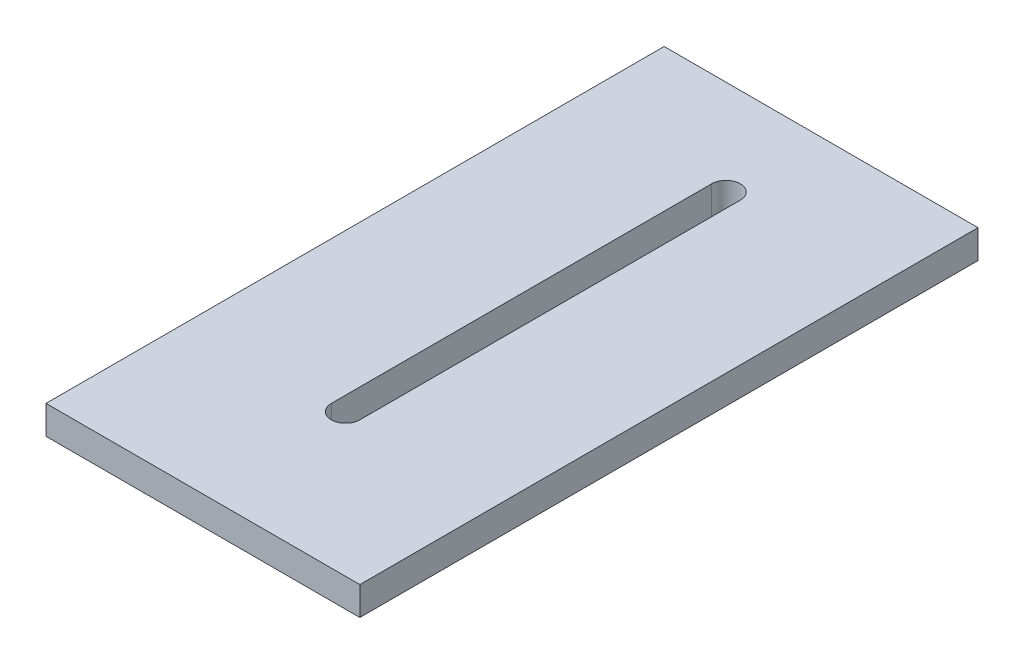
ISO-10303-21;
HEADER;
FILE_DESCRIPTION(('STEP AP214'),'2;1');
FILE_NAME('part.step','',(''),(''),'','','');
FILE_SCHEMA(('AUTOMOTIVE_DESIGN { 1 0 10303 214 1 1 1 1 }'));
ENDSEC;
DATA;
#1=APPLICATION_CONTEXT('core data for automotive mechanical design processes');
#2=APPLICATION_PROTOCOL_DEFINITION('international standard','automotive_design',2000,#1);
#3=PRODUCT_CONTEXT('',#1,'mechanical');
#4=PRODUCT('Part','Part','',(#3));
#5=PRODUCT_RELATED_PRODUCT_CATEGORY('part','',(#4));
#6=PRODUCT_DEFINITION_FORMATION('','',#4);
#7=PRODUCT_DEFINITION_CONTEXT('part definition',#1,'design');
#8=PRODUCT_DEFINITION('design','',#6,#7);
#9=PRODUCT_DEFINITION_SHAPE('','',#8);
#10=(LENGTH_UNIT() NAMED_UNIT(*) SI_UNIT(.MILLI.,.METRE.));
#11=(NAMED_UNIT(*) PLANE_ANGLE_UNIT() SI_UNIT($,.RADIAN.));
#12=(NAMED_UNIT(*) SI_UNIT($,.STERADIAN.) SOLID_ANGLE_UNIT());
#13=UNCERTAINTY_MEASURE_WITH_UNIT(LENGTH_MEASURE(1.E-05),#10,'distance_accuracy_value','');
#14=(GEOMETRIC_REPRESENTATION_CONTEXT(3) GLOBAL_UNCERTAINTY_ASSIGNED_CONTEXT((#13)) GLOBAL_UNIT_ASSIGNED_CONTEXT((#10,
#11,#12)) REPRESENTATION_CONTEXT('',''));
#15=CARTESIAN_POINT('',(0.,0.,0.));
#16=DIRECTION('',(0.,0.,1.));
#17=DIRECTION('',(1.,0.,0.));
#18=AXIS2_PLACEMENT_3D('',#15,#16,#17);
#19=CARTESIAN_POINT('',(0.,3.,0.));
#20=DIRECTION('',(0.,-1.,0.));
#21=DIRECTION('',(0.,0.,-1.));
#22=AXIS2_PLACEMENT_3D('',#19,#20,#21);
#23=PLANE('',#22);
#24=DIRECTION('',(0.,0.,1.));
#25=VECTOR('',#24,1.);
#26=CARTESIAN_POINT('',(0.,3.,0.));
#27=LINE('',#26,#25);
#28=CARTESIAN_POINT('',(0.,3.,-65.));
#29=VERTEX_POINT('',#28);
#30=CARTESIAN_POINT('',(0.,3.,0.));
#31=VERTEX_POINT('',#30);
#32=EDGE_CURVE('E136',#29,#31,#27,.T.);
#33=ORIENTED_EDGE('',*,*,#32,.T.);
#34=DIRECTION('',(1.,0.,0.));
#35=VECTOR('',#34,1.);
#36=CARTESIAN_POINT('',(0.,3.,0.));
#37=LINE('',#36,#35);
#38=CARTESIAN_POINT('',(33.,3.,0.));
#39=VERTEX_POINT('',#38);
#40=EDGE_CURVE('E139',#31,#39,#37,.T.);
#41=ORIENTED_EDGE('',*,*,#40,.T.);
#42=DIRECTION('',(0.,0.,-1.));
#43=VECTOR('',#42,1.);
#44=CARTESIAN_POINT('',(33.,3.,0.));
#45=LINE('',#44,#43);
#46=CARTESIAN_POINT('',(33.,3.,-65.));
#47=VERTEX_POINT('',#46);
#48=EDGE_CURVE('E142',#39,#47,#45,.T.);
#49=ORIENTED_EDGE('',*,*,#48,.T.);
#50=DIRECTION('',(-1.,0.,0.));
#51=VECTOR('',#50,1.);
#52=CARTESIAN_POINT('',(0.,3.,-65.));
#53=LINE('',#52,#51);
#54=EDGE_CURVE('E144',#47,#29,#53,.T.);
#55=ORIENTED_EDGE('',*,*,#54,.T.);
#56=EDGE_LOOP('',(#33,#41,#49,#55));
#57=FACE_BOUND('',#56,.T.);
#58=CARTESIAN_POINT('',(16.5,3.,-15.));
#59=DIRECTION('',(0.,1.,0.));
#60=DIRECTION('',(0.,0.,1.));
#61=AXIS2_PLACEMENT_3D('',#58,#59,#60);
#62=CIRCLE('',#61,1.5);
#63=CARTESIAN_POINT('',(15.,3.,-15.));
#64=VERTEX_POINT('',#63);
#65=CARTESIAN_POINT('',(18.,3.,-15.));
#66=VERTEX_POINT('',#65);
#67=EDGE_CURVE('E100',#64,#66,#62,.T.);
#68=ORIENTED_EDGE('',*,*,#67,.F.);
#69=DIRECTION('',(0.,0.,1.));
#70=VECTOR('',#69,1.);
#71=CARTESIAN_POINT('',(15.,3.,-15.));
#72=LINE('',#71,#70);
#73=CARTESIAN_POINT('',(15.,3.,-55.));
#74=VERTEX_POINT('',#73);
#75=EDGE_CURVE('E122',#74,#64,#72,.T.);
#76=ORIENTED_EDGE('',*,*,#75,.F.);
#77=CARTESIAN_POINT('',(16.5,3.,-55.));
#78=DIRECTION('',(0.,1.,0.));
#79=DIRECTION('',(0.,0.,1.));
#80=AXIS2_PLACEMENT_3D('',#77,#78,#79);
#81=CIRCLE('',#80,1.5);
#82=CARTESIAN_POINT('',(18.,3.,-55.));
#83=VERTEX_POINT('',#82);
#84=EDGE_CURVE('E120',#83,#74,#81,.T.);
#85=ORIENTED_EDGE('',*,*,#84,.F.);
#86=DIRECTION('',(0.,0.,-1.));
#87=VECTOR('',#86,1.);
#88=CARTESIAN_POINT('',(18.,3.,-55.));
#89=LINE('',#88,#87);
#90=EDGE_CURVE('E108',#66,#83,#89,.T.);
#91=ORIENTED_EDGE('',*,*,#90,.F.);
#92=EDGE_LOOP('',(#68,#76,#85,#91));
#93=FACE_BOUND('',#92,.T.);
#94=ADVANCED_FACE('F35',(#57,#93),#23,.F.);
#95=CARTESIAN_POINT('',(0.,0.,0.));
#96=DIRECTION('',(0.,-1.,0.));
#97=DIRECTION('',(0.,0.,-1.));
#98=AXIS2_PLACEMENT_3D('',#95,#96,#97);
#99=PLANE('',#98);
#100=DIRECTION('',(0.,0.,1.));
#101=VECTOR('',#100,1.);
#102=CARTESIAN_POINT('',(0.,0.,0.));
#103=LINE('',#102,#101);
#104=CARTESIAN_POINT('',(0.,0.,-65.));
#105=VERTEX_POINT('',#104);
#106=CARTESIAN_POINT('',(0.,0.,0.));
#107=VERTEX_POINT('',#106);
#108=EDGE_CURVE('E116',#105,#107,#103,.T.);
#109=ORIENTED_EDGE('',*,*,#108,.F.);
#110=DIRECTION('',(-1.,0.,0.));
#111=VECTOR('',#110,1.);
#112=CARTESIAN_POINT('',(0.,0.,-65.));
#113=LINE('',#112,#111);
#114=CARTESIAN_POINT('',(33.,0.,-65.));
#115=VERTEX_POINT('',#114);
#116=EDGE_CURVE('E140',#115,#105,#113,.T.);
#117=ORIENTED_EDGE('',*,*,#116,.F.);
#118=DIRECTION('',(0.,0.,-1.));
#119=VECTOR('',#118,1.);
#120=CARTESIAN_POINT('',(33.,0.,0.));
#121=LINE('',#120,#119);
#122=CARTESIAN_POINT('',(33.,0.,0.));
#123=VERTEX_POINT('',#122);
#124=EDGE_CURVE('E151',#123,#115,#121,.T.);
#125=ORIENTED_EDGE('',*,*,#124,.F.);
#126=DIRECTION('',(1.,0.,0.));
#127=VECTOR('',#126,1.);
#128=CARTESIAN_POINT('',(0.,0.,0.));
#129=LINE('',#128,#127);
#130=EDGE_CURVE('E149',#107,#123,#129,.T.);
#131=ORIENTED_EDGE('',*,*,#130,.F.);
#132=EDGE_LOOP('',(#109,#117,#125,#131));
#133=FACE_BOUND('',#132,.T.);
#134=DIRECTION('',(0.,0.,1.));
#135=VECTOR('',#134,1.);
#136=CARTESIAN_POINT('',(15.,0.,-15.));
#137=LINE('',#136,#135);
#138=CARTESIAN_POINT('',(15.,0.,-55.));
#139=VERTEX_POINT('',#138);
#140=CARTESIAN_POINT('',(15.,0.,-15.));
#141=VERTEX_POINT('',#140);
#142=EDGE_CURVE('E109',#139,#141,#137,.T.);
#143=ORIENTED_EDGE('',*,*,#142,.T.);
#144=CARTESIAN_POINT('',(16.5,0.,-15.));
#145=DIRECTION('',(0.,1.,0.));
#146=DIRECTION('',(0.,0.,1.));
#147=AXIS2_PLACEMENT_3D('',#144,#145,#146);
#148=CIRCLE('',#147,1.5);
#149=CARTESIAN_POINT('',(18.,0.,-15.));
#150=VERTEX_POINT('',#149);
#151=EDGE_CURVE('E58',#141,#150,#148,.T.);
#152=ORIENTED_EDGE('',*,*,#151,.T.);
#153=DIRECTION('',(0.,0.,-1.));
#154=VECTOR('',#153,1.);
#155=CARTESIAN_POINT('',(18.,0.,-55.));
#156=LINE('',#155,#154);
#157=CARTESIAN_POINT('',(18.,0.,-55.));
#158=VERTEX_POINT('',#157);
#159=EDGE_CURVE('E115',#150,#158,#156,.T.);
#160=ORIENTED_EDGE('',*,*,#159,.T.);
#161=CARTESIAN_POINT('',(16.5,0.,-55.));
#162=DIRECTION('',(0.,1.,0.));
#163=DIRECTION('',(0.,0.,1.));
#164=AXIS2_PLACEMENT_3D('',#161,#162,#163);
#165=CIRCLE('',#164,1.5);
#166=EDGE_CURVE('E128',#158,#139,#165,.T.);
#167=ORIENTED_EDGE('',*,*,#166,.T.);
#168=EDGE_LOOP('',(#143,#152,#160,#167));
#169=FACE_BOUND('',#168,.T.);
#170=ADVANCED_FACE('F169',(#133,#169),#99,.T.);
#171=CARTESIAN_POINT('',(0.,3.,0.));
#172=DIRECTION('',(1.,0.,0.));
#173=DIRECTION('',(0.,0.,-1.));
#174=AXIS2_PLACEMENT_3D('',#171,#172,#173);
#175=PLANE('',#174);
#176=ORIENTED_EDGE('',*,*,#108,.T.);
#177=DIRECTION('',(0.,-1.,0.));
#178=VECTOR('',#177,1.);
#179=CARTESIAN_POINT('',(0.,3.,0.));
#180=LINE('',#179,#178);
#181=EDGE_CURVE('E11',#31,#107,#180,.T.);
#182=ORIENTED_EDGE('',*,*,#181,.F.);
#183=ORIENTED_EDGE('',*,*,#32,.F.);
#184=DIRECTION('',(0.,-1.,0.));
#185=VECTOR('',#184,1.);
#186=CARTESIAN_POINT('',(0.,3.,-65.));
#187=LINE('',#186,#185);
#188=EDGE_CURVE('E146',#29,#105,#187,.T.);
#189=ORIENTED_EDGE('',*,*,#188,.T.);
#190=EDGE_LOOP('',(#176,#182,#183,#189));
#191=FACE_BOUND('',#190,.T.);
#192=ADVANCED_FACE('F37',(#191),#175,.F.);
#193=CARTESIAN_POINT('',(0.,3.,0.));
#194=DIRECTION('',(0.,0.,-1.));
#195=DIRECTION('',(-1.,0.,0.));
#196=AXIS2_PLACEMENT_3D('',#193,#194,#195);
#197=PLANE('',#196);
#198=ORIENTED_EDGE('',*,*,#130,.T.);
#199=DIRECTION('',(0.,-1.,0.));
#200=VECTOR('',#199,1.);
#201=CARTESIAN_POINT('',(33.,3.,0.));
#202=LINE('',#201,#200);
#203=EDGE_CURVE('E43',#39,#123,#202,.T.);
#204=ORIENTED_EDGE('',*,*,#203,.F.);
#205=ORIENTED_EDGE('',*,*,#40,.F.);
#206=ORIENTED_EDGE('',*,*,#181,.T.);
#207=EDGE_LOOP('',(#198,#204,#205,#206));
#208=FACE_BOUND('',#207,.T.);
#209=ADVANCED_FACE('F179',(#208),#197,.F.);
#210=CARTESIAN_POINT('',(33.,3.,0.));
#211=DIRECTION('',(-1.,0.,0.));
#212=DIRECTION('',(0.,0.,1.));
#213=AXIS2_PLACEMENT_3D('',#210,#211,#212);
#214=PLANE('',#213);
#215=ORIENTED_EDGE('',*,*,#124,.T.);
#216=DIRECTION('',(0.,-1.,0.));
#217=VECTOR('',#216,1.);
#218=CARTESIAN_POINT('',(33.,3.,-65.));
#219=LINE('',#218,#217);
#220=EDGE_CURVE('E156',#47,#115,#219,.T.);
#221=ORIENTED_EDGE('',*,*,#220,.F.);
#222=ORIENTED_EDGE('',*,*,#48,.F.);
#223=ORIENTED_EDGE('',*,*,#203,.T.);
#224=EDGE_LOOP('',(#215,#221,#222,#223));
#225=FACE_BOUND('',#224,.T.);
#226=ADVANCED_FACE('F163',(#225),#214,.F.);
#227=CARTESIAN_POINT('',(0.,3.,-65.));
#228=DIRECTION('',(0.,0.,1.));
#229=DIRECTION('',(1.,0.,0.));
#230=AXIS2_PLACEMENT_3D('',#227,#228,#229);
#231=PLANE('',#230);
#232=ORIENTED_EDGE('',*,*,#116,.T.);
#233=ORIENTED_EDGE('',*,*,#188,.F.);
#234=ORIENTED_EDGE('',*,*,#54,.F.);
#235=ORIENTED_EDGE('',*,*,#220,.T.);
#236=EDGE_LOOP('',(#232,#233,#234,#235));
#237=FACE_BOUND('',#236,.T.);
#238=ADVANCED_FACE('F173',(#237),#231,.F.);
#239=CARTESIAN_POINT('',(16.5,3.,-15.));
#240=DIRECTION('',(0.,-1.,0.));
#241=DIRECTION('',(0.,0.,-1.));
#242=AXIS2_PLACEMENT_3D('',#239,#240,#241);
#243=CYLINDRICAL_SURFACE('',#242,1.5);
#244=ORIENTED_EDGE('',*,*,#151,.F.);
#245=DIRECTION('',(0.,-1.,0.));
#246=VECTOR('',#245,1.);
#247=CARTESIAN_POINT('',(15.,3.,-15.));
#248=LINE('',#247,#246);
#249=EDGE_CURVE('E104',#64,#141,#248,.T.);
#250=ORIENTED_EDGE('',*,*,#249,.F.);
#251=ORIENTED_EDGE('',*,*,#67,.T.);
#252=DIRECTION('',(0.,-1.,0.));
#253=VECTOR('',#252,1.);
#254=CARTESIAN_POINT('',(18.,3.,-15.));
#255=LINE('',#254,#253);
#256=EDGE_CURVE('E103',#66,#150,#255,.T.);
#257=ORIENTED_EDGE('',*,*,#256,.T.);
#258=EDGE_LOOP('',(#244,#250,#251,#257));
#259=FACE_BOUND('',#258,.T.);
#260=ADVANCED_FACE('F102',(#259),#243,.F.);
#261=CARTESIAN_POINT('',(18.,3.,-55.));
#262=DIRECTION('',(-1.,0.,0.));
#263=DIRECTION('',(0.,0.,1.));
#264=AXIS2_PLACEMENT_3D('',#261,#262,#263);
#265=PLANE('',#264);
#266=ORIENTED_EDGE('',*,*,#159,.F.);
#267=ORIENTED_EDGE('',*,*,#256,.F.);
#268=ORIENTED_EDGE('',*,*,#90,.T.);
#269=DIRECTION('',(0.,-1.,0.));
#270=VECTOR('',#269,1.);
#271=CARTESIAN_POINT('',(18.,3.,-55.));
#272=LINE('',#271,#270);
#273=EDGE_CURVE('E117',#83,#158,#272,.T.);
#274=ORIENTED_EDGE('',*,*,#273,.T.);
#275=EDGE_LOOP('',(#266,#267,#268,#274));
#276=FACE_BOUND('',#275,.T.);
#277=ADVANCED_FACE('F112',(#276),#265,.T.);
#278=CARTESIAN_POINT('',(16.5,3.,-55.));
#279=DIRECTION('',(0.,-1.,0.));
#280=DIRECTION('',(0.,0.,-1.));
#281=AXIS2_PLACEMENT_3D('',#278,#279,#280);
#282=CYLINDRICAL_SURFACE('',#281,1.5);
#283=ORIENTED_EDGE('',*,*,#166,.F.);
#284=ORIENTED_EDGE('',*,*,#273,.F.);
#285=ORIENTED_EDGE('',*,*,#84,.T.);
#286=DIRECTION('',(0.,-1.,0.));
#287=VECTOR('',#286,1.);
#288=CARTESIAN_POINT('',(15.,3.,-55.));
#289=LINE('',#288,#287);
#290=EDGE_CURVE('E50',#74,#139,#289,.T.);
#291=ORIENTED_EDGE('',*,*,#290,.T.);
#292=EDGE_LOOP('',(#283,#284,#285,#291));
#293=FACE_BOUND('',#292,.T.);
#294=ADVANCED_FACE('F202',(#293),#282,.F.);
#295=CARTESIAN_POINT('',(15.,3.,-15.));
#296=DIRECTION('',(1.,0.,0.));
#297=DIRECTION('',(0.,0.,-1.));
#298=AXIS2_PLACEMENT_3D('',#295,#296,#297);
#299=PLANE('',#298);
#300=ORIENTED_EDGE('',*,*,#142,.F.);
#301=ORIENTED_EDGE('',*,*,#290,.F.);
#302=ORIENTED_EDGE('',*,*,#75,.T.);
#303=ORIENTED_EDGE('',*,*,#249,.T.);
#304=EDGE_LOOP('',(#300,#301,#302,#303));
#305=FACE_BOUND('',#304,.T.);
#306=ADVANCED_FACE('F206',(#305),#299,.T.);
#307=CLOSED_SHELL('',(#94,#170,#192,#209,#226,#238,#260,#277,#294,#306));
#308=MANIFOLD_SOLID_BREP('B2',#307);
#309=ADVANCED_BREP_SHAPE_REPRESENTATION('',(#18,#308),#14);
#310=SHAPE_DEFINITION_REPRESENTATION(#9,#309);
ENDSEC;
END-ISO-10303-21;
